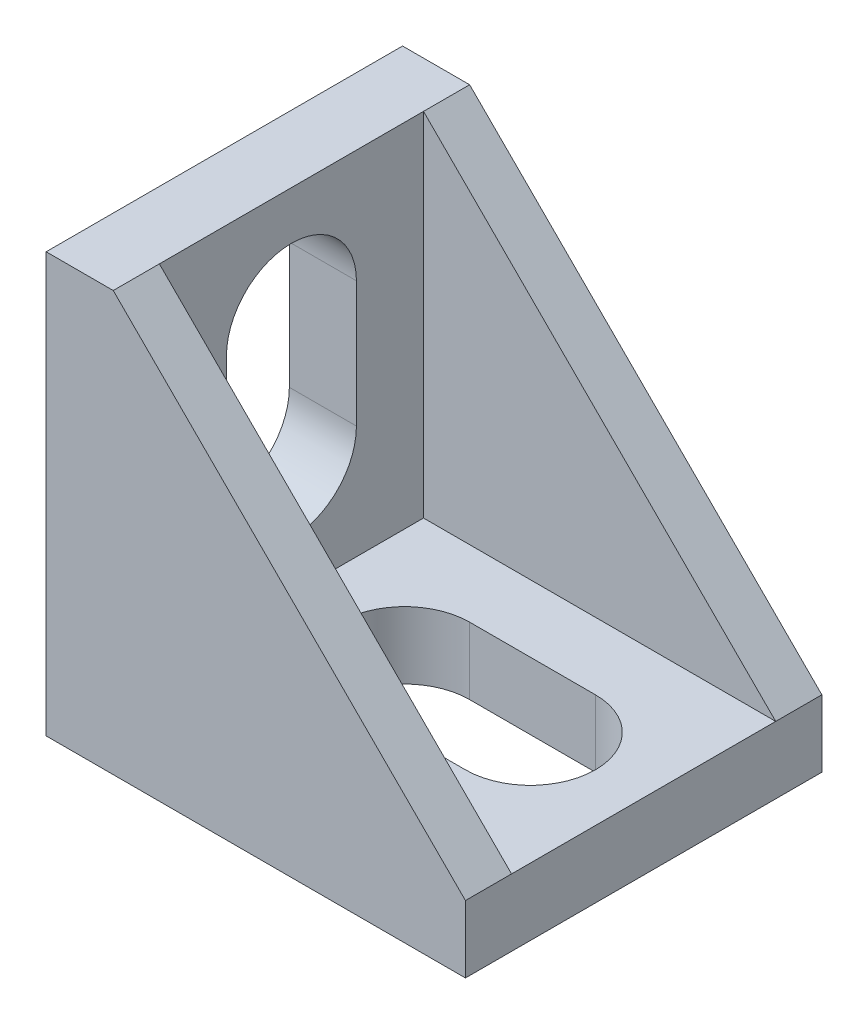
ISO-10303-21;
HEADER;
FILE_DESCRIPTION(('STEP AP214'),'2;1');
FILE_NAME('part.step','',(''),(''),'','','');
FILE_SCHEMA(('AUTOMOTIVE_DESIGN { 1 0 10303 214 1 1 1 1 }'));
ENDSEC;
DATA;
#1=APPLICATION_CONTEXT('core data for automotive mechanical design processes');
#2=APPLICATION_PROTOCOL_DEFINITION('international standard','automotive_design',2000,#1);
#3=PRODUCT_CONTEXT('',#1,'mechanical');
#4=PRODUCT('Part','Part','',(#3));
#5=PRODUCT_RELATED_PRODUCT_CATEGORY('part','',(#4));
#6=PRODUCT_DEFINITION_FORMATION('','',#4);
#7=PRODUCT_DEFINITION_CONTEXT('part definition',#1,'design');
#8=PRODUCT_DEFINITION('design','',#6,#7);
#9=PRODUCT_DEFINITION_SHAPE('','',#8);
#10=(LENGTH_UNIT() NAMED_UNIT(*) SI_UNIT(.MILLI.,.METRE.));
#11=(NAMED_UNIT(*) PLANE_ANGLE_UNIT() SI_UNIT($,.RADIAN.));
#12=(NAMED_UNIT(*) SI_UNIT($,.STERADIAN.) SOLID_ANGLE_UNIT());
#13=UNCERTAINTY_MEASURE_WITH_UNIT(LENGTH_MEASURE(1.E-05),#10,'distance_accuracy_value','');
#14=(GEOMETRIC_REPRESENTATION_CONTEXT(3) GLOBAL_UNCERTAINTY_ASSIGNED_CONTEXT((#13)) GLOBAL_UNIT_ASSIGNED_CONTEXT((#10,
#11,#12)) REPRESENTATION_CONTEXT('',''));
#15=CARTESIAN_POINT('',(0.,0.,0.));
#16=DIRECTION('',(0.,0.,1.));
#17=DIRECTION('',(1.,0.,0.));
#18=AXIS2_PLACEMENT_3D('',#15,#16,#17);
#19=CARTESIAN_POINT('',(3.2,20.,17.));
#20=DIRECTION('',(-0.707106781186547,-0.707106781186547,0.));
#21=DIRECTION('',(0.707106781186548,-0.707106781186548,0.));
#22=AXIS2_PLACEMENT_3D('',#19,#20,#21);
#23=PLANE('',#22);
#24=DIRECTION('',(0.,0.,-1.));
#25=VECTOR('',#24,1.);
#26=CARTESIAN_POINT('',(3.2,20.,17.));
#27=LINE('',#26,#25);
#28=CARTESIAN_POINT('',(3.2,20.,2.2));
#29=VERTEX_POINT('',#28);
#30=CARTESIAN_POINT('',(3.2,20.,0.));
#31=VERTEX_POINT('',#30);
#32=EDGE_CURVE('E259',#29,#31,#27,.T.);
#33=ORIENTED_EDGE('',*,*,#32,.F.);
#34=DIRECTION('',(0.707106781186548,-0.707106781186548,0.));
#35=VECTOR('',#34,1.);
#36=CARTESIAN_POINT('',(3.2,20.,2.2));
#37=LINE('',#36,#35);
#38=CARTESIAN_POINT('',(20.,3.2,2.2));
#39=VERTEX_POINT('',#38);
#40=EDGE_CURVE('E11',#29,#39,#37,.T.);
#41=ORIENTED_EDGE('',*,*,#40,.T.);
#42=DIRECTION('',(0.,0.,-1.));
#43=VECTOR('',#42,1.);
#44=CARTESIAN_POINT('',(20.,3.2,17.));
#45=LINE('',#44,#43);
#46=CARTESIAN_POINT('',(20.,3.2,0.));
#47=VERTEX_POINT('',#46);
#48=EDGE_CURVE('E263',#39,#47,#45,.T.);
#49=ORIENTED_EDGE('',*,*,#48,.T.);
#50=DIRECTION('',(-0.707106781186548,0.707106781186548,0.));
#51=VECTOR('',#50,1.);
#52=CARTESIAN_POINT('',(3.2,20.,0.));
#53=LINE('',#52,#51);
#54=EDGE_CURVE('E253',#47,#31,#53,.T.);
#55=ORIENTED_EDGE('',*,*,#54,.T.);
#56=EDGE_LOOP('',(#33,#41,#49,#55));
#57=FACE_BOUND('',#56,.T.);
#58=ADVANCED_FACE('F35',(#57),#23,.F.);
#59=CARTESIAN_POINT('',(0.,0.,17.));
#60=DIRECTION('',(1.,0.,0.));
#61=DIRECTION('',(0.,0.,-1.));
#62=AXIS2_PLACEMENT_3D('',#59,#60,#61);
#63=PLANE('',#62);
#64=DIRECTION('',(0.,1.,0.));
#65=VECTOR('',#64,1.);
#66=CARTESIAN_POINT('',(0.,0.,5.4));
#67=LINE('',#66,#65);
#68=CARTESIAN_POINT('',(0.,8.6,5.4));
#69=VERTEX_POINT('',#68);
#70=CARTESIAN_POINT('',(0.,14.6,5.4));
#71=VERTEX_POINT('',#70);
#72=EDGE_CURVE('E179',#69,#71,#67,.T.);
#73=ORIENTED_EDGE('',*,*,#72,.T.);
#74=CARTESIAN_POINT('',(0.,14.6,8.5));
#75=DIRECTION('',(1.,0.,0.));
#76=DIRECTION('',(0.,0.,-1.));
#77=AXIS2_PLACEMENT_3D('',#74,#75,#76);
#78=CIRCLE('',#77,3.1);
#79=CARTESIAN_POINT('',(0.,14.6,11.6));
#80=VERTEX_POINT('',#79);
#81=EDGE_CURVE('E182',#71,#80,#78,.T.);
#82=ORIENTED_EDGE('',*,*,#81,.T.);
#83=DIRECTION('',(0.,-1.,0.));
#84=VECTOR('',#83,1.);
#85=CARTESIAN_POINT('',(0.,0.,11.6));
#86=LINE('',#85,#84);
#87=CARTESIAN_POINT('',(0.,8.6,11.6));
#88=VERTEX_POINT('',#87);
#89=EDGE_CURVE('E174',#80,#88,#86,.T.);
#90=ORIENTED_EDGE('',*,*,#89,.T.);
#91=CARTESIAN_POINT('',(0.,8.6,8.5));
#92=DIRECTION('',(1.,0.,0.));
#93=DIRECTION('',(0.,0.,-1.));
#94=AXIS2_PLACEMENT_3D('',#91,#92,#93);
#95=CIRCLE('',#94,3.1);
#96=EDGE_CURVE('E154',#88,#69,#95,.T.);
#97=ORIENTED_EDGE('',*,*,#96,.T.);
#98=EDGE_LOOP('',(#73,#82,#90,#97));
#99=FACE_BOUND('',#98,.T.);
#100=DIRECTION('',(0.,-1.,0.));
#101=VECTOR('',#100,1.);
#102=CARTESIAN_POINT('',(0.,0.,0.));
#103=LINE('',#102,#101);
#104=CARTESIAN_POINT('',(0.,20.,0.));
#105=VERTEX_POINT('',#104);
#106=CARTESIAN_POINT('',(0.,0.,0.));
#107=VERTEX_POINT('',#106);
#108=EDGE_CURVE('E231',#105,#107,#103,.T.);
#109=ORIENTED_EDGE('',*,*,#108,.T.);
#110=DIRECTION('',(0.,0.,-1.));
#111=VECTOR('',#110,1.);
#112=CARTESIAN_POINT('',(0.,0.,17.));
#113=LINE('',#112,#111);
#114=CARTESIAN_POINT('',(0.,0.,17.));
#115=VERTEX_POINT('',#114);
#116=EDGE_CURVE('E271',#115,#107,#113,.T.);
#117=ORIENTED_EDGE('',*,*,#116,.F.);
#118=DIRECTION('',(0.,-1.,0.));
#119=VECTOR('',#118,1.);
#120=CARTESIAN_POINT('',(0.,0.,17.));
#121=LINE('',#120,#119);
#122=CARTESIAN_POINT('',(0.,20.,17.));
#123=VERTEX_POINT('',#122);
#124=EDGE_CURVE('E233',#123,#115,#121,.T.);
#125=ORIENTED_EDGE('',*,*,#124,.F.);
#126=DIRECTION('',(0.,0.,-1.));
#127=VECTOR('',#126,1.);
#128=CARTESIAN_POINT('',(0.,20.,17.));
#129=LINE('',#128,#127);
#130=EDGE_CURVE('E245',#123,#105,#129,.T.);
#131=ORIENTED_EDGE('',*,*,#130,.T.);
#132=EDGE_LOOP('',(#109,#117,#125,#131));
#133=FACE_BOUND('',#132,.T.);
#134=ADVANCED_FACE('F37',(#99,#133),#63,.F.);
#135=CARTESIAN_POINT('',(0.,0.,17.));
#136=DIRECTION('',(0.,1.,0.));
#137=DIRECTION('',(0.,0.,1.));
#138=AXIS2_PLACEMENT_3D('',#135,#136,#137);
#139=PLANE('',#138);
#140=DIRECTION('',(-1.,0.,0.));
#141=VECTOR('',#140,1.);
#142=CARTESIAN_POINT('',(0.,0.,5.4));
#143=LINE('',#142,#141);
#144=CARTESIAN_POINT('',(14.6,0.,5.4));
#145=VERTEX_POINT('',#144);
#146=CARTESIAN_POINT('',(8.6,0.,5.4));
#147=VERTEX_POINT('',#146);
#148=EDGE_CURVE('E211',#145,#147,#143,.T.);
#149=ORIENTED_EDGE('',*,*,#148,.T.);
#150=CARTESIAN_POINT('',(8.6,0.,8.5));
#151=DIRECTION('',(0.,1.,0.));
#152=DIRECTION('',(0.,0.,1.));
#153=AXIS2_PLACEMENT_3D('',#150,#151,#152);
#154=CIRCLE('',#153,3.1);
#155=CARTESIAN_POINT('',(8.6,0.,11.6));
#156=VERTEX_POINT('',#155);
#157=EDGE_CURVE('E214',#147,#156,#154,.T.);
#158=ORIENTED_EDGE('',*,*,#157,.T.);
#159=DIRECTION('',(1.,0.,0.));
#160=VECTOR('',#159,1.);
#161=CARTESIAN_POINT('',(0.,0.,11.6));
#162=LINE('',#161,#160);
#163=CARTESIAN_POINT('',(14.6,0.,11.6));
#164=VERTEX_POINT('',#163);
#165=EDGE_CURVE('E199',#156,#164,#162,.T.);
#166=ORIENTED_EDGE('',*,*,#165,.T.);
#167=CARTESIAN_POINT('',(14.6,0.,8.5));
#168=DIRECTION('',(0.,1.,0.));
#169=DIRECTION('',(0.,0.,1.));
#170=AXIS2_PLACEMENT_3D('',#167,#168,#169);
#171=CIRCLE('',#170,3.1);
#172=EDGE_CURVE('E208',#164,#145,#171,.T.);
#173=ORIENTED_EDGE('',*,*,#172,.T.);
#174=EDGE_LOOP('',(#149,#158,#166,#173));
#175=FACE_BOUND('',#174,.T.);
#176=DIRECTION('',(1.,0.,0.));
#177=VECTOR('',#176,1.);
#178=CARTESIAN_POINT('',(0.,0.,0.));
#179=LINE('',#178,#177);
#180=CARTESIAN_POINT('',(20.,0.,0.));
#181=VERTEX_POINT('',#180);
#182=EDGE_CURVE('E248',#107,#181,#179,.T.);
#183=ORIENTED_EDGE('',*,*,#182,.T.);
#184=DIRECTION('',(0.,0.,-1.));
#185=VECTOR('',#184,1.);
#186=CARTESIAN_POINT('',(20.,0.,17.));
#187=LINE('',#186,#185);
#188=CARTESIAN_POINT('',(20.,0.,17.));
#189=VERTEX_POINT('',#188);
#190=EDGE_CURVE('E267',#189,#181,#187,.T.);
#191=ORIENTED_EDGE('',*,*,#190,.F.);
#192=DIRECTION('',(1.,0.,0.));
#193=VECTOR('',#192,1.);
#194=CARTESIAN_POINT('',(0.,0.,17.));
#195=LINE('',#194,#193);
#196=EDGE_CURVE('E236',#115,#189,#195,.T.);
#197=ORIENTED_EDGE('',*,*,#196,.F.);
#198=ORIENTED_EDGE('',*,*,#116,.T.);
#199=EDGE_LOOP('',(#183,#191,#197,#198));
#200=FACE_BOUND('',#199,.T.);
#201=ADVANCED_FACE('F309',(#175,#200),#139,.F.);
#202=CARTESIAN_POINT('',(20.,0.,17.));
#203=DIRECTION('',(-1.,0.,0.));
#204=DIRECTION('',(0.,0.,1.));
#205=AXIS2_PLACEMENT_3D('',#202,#203,#204);
#206=PLANE('',#205);
#207=DIRECTION('',(0.,1.,0.));
#208=VECTOR('',#207,1.);
#209=CARTESIAN_POINT('',(20.,0.,0.));
#210=LINE('',#209,#208);
#211=EDGE_CURVE('E250',#181,#47,#210,.T.);
#212=ORIENTED_EDGE('',*,*,#211,.T.);
#213=ORIENTED_EDGE('',*,*,#48,.F.);
#214=CARTESIAN_POINT('',(20.,3.2,14.8));
#215=VERTEX_POINT('',#214);
#216=EDGE_CURVE('E268',#215,#39,#45,.T.);
#217=ORIENTED_EDGE('',*,*,#216,.F.);
#218=CARTESIAN_POINT('',(20.,3.2,17.));
#219=VERTEX_POINT('',#218);
#220=EDGE_CURVE('E264',#219,#215,#45,.T.);
#221=ORIENTED_EDGE('',*,*,#220,.F.);
#222=DIRECTION('',(0.,1.,0.));
#223=VECTOR('',#222,1.);
#224=CARTESIAN_POINT('',(20.,0.,17.));
#225=LINE('',#224,#223);
#226=EDGE_CURVE('E239',#189,#219,#225,.T.);
#227=ORIENTED_EDGE('',*,*,#226,.F.);
#228=ORIENTED_EDGE('',*,*,#190,.T.);
#229=EDGE_LOOP('',(#212,#213,#217,#221,#227,#228));
#230=FACE_BOUND('',#229,.T.);
#231=ADVANCED_FACE('F294',(#230),#206,.F.);
#232=ORIENTED_EDGE('',*,*,#220,.T.);
#233=DIRECTION('',(-0.707106781186548,0.707106781186548,0.));
#234=VECTOR('',#233,1.);
#235=CARTESIAN_POINT('',(3.2,20.,14.8));
#236=LINE('',#235,#234);
#237=CARTESIAN_POINT('',(3.2,20.,14.8));
#238=VERTEX_POINT('',#237);
#239=EDGE_CURVE('E43',#215,#238,#236,.T.);
#240=ORIENTED_EDGE('',*,*,#239,.T.);
#241=CARTESIAN_POINT('',(3.2,20.,17.));
#242=VERTEX_POINT('',#241);
#243=EDGE_CURVE('E260',#242,#238,#27,.T.);
#244=ORIENTED_EDGE('',*,*,#243,.F.);
#245=DIRECTION('',(-0.707106781186548,0.707106781186548,0.));
#246=VECTOR('',#245,1.);
#247=CARTESIAN_POINT('',(3.2,20.,17.));
#248=LINE('',#247,#246);
#249=EDGE_CURVE('E241',#219,#242,#248,.T.);
#250=ORIENTED_EDGE('',*,*,#249,.F.);
#251=EDGE_LOOP('',(#232,#240,#244,#250));
#252=FACE_BOUND('',#251,.T.);
#253=ADVANCED_FACE('F276',(#252),#23,.F.);
#254=CARTESIAN_POINT('',(0.,20.,17.));
#255=DIRECTION('',(0.,-1.,0.));
#256=DIRECTION('',(0.,0.,-1.));
#257=AXIS2_PLACEMENT_3D('',#254,#255,#256);
#258=PLANE('',#257);
#259=DIRECTION('',(-1.,0.,0.));
#260=VECTOR('',#259,1.);
#261=CARTESIAN_POINT('',(0.,20.,0.));
#262=LINE('',#261,#260);
#263=EDGE_CURVE('E237',#31,#105,#262,.T.);
#264=ORIENTED_EDGE('',*,*,#263,.T.);
#265=ORIENTED_EDGE('',*,*,#130,.F.);
#266=DIRECTION('',(-1.,0.,0.));
#267=VECTOR('',#266,1.);
#268=CARTESIAN_POINT('',(0.,20.,17.));
#269=LINE('',#268,#267);
#270=EDGE_CURVE('E243',#242,#123,#269,.T.);
#271=ORIENTED_EDGE('',*,*,#270,.F.);
#272=ORIENTED_EDGE('',*,*,#243,.T.);
#273=DIRECTION('',(0.,0.,1.));
#274=VECTOR('',#273,1.);
#275=CARTESIAN_POINT('',(3.2,20.,2.2));
#276=LINE('',#275,#274);
#277=EDGE_CURVE('E217',#29,#238,#276,.T.);
#278=ORIENTED_EDGE('',*,*,#277,.F.);
#279=ORIENTED_EDGE('',*,*,#32,.T.);
#280=EDGE_LOOP('',(#264,#265,#271,#272,#278,#279));
#281=FACE_BOUND('',#280,.T.);
#282=ADVANCED_FACE('F284',(#281),#258,.F.);
#283=CARTESIAN_POINT('',(0.,0.,17.));
#284=DIRECTION('',(0.,0.,-1.));
#285=DIRECTION('',(-1.,0.,0.));
#286=AXIS2_PLACEMENT_3D('',#283,#284,#285);
#287=PLANE('',#286);
#288=ORIENTED_EDGE('',*,*,#124,.T.);
#289=ORIENTED_EDGE('',*,*,#196,.T.);
#290=ORIENTED_EDGE('',*,*,#226,.T.);
#291=ORIENTED_EDGE('',*,*,#249,.T.);
#292=ORIENTED_EDGE('',*,*,#270,.T.);
#293=EDGE_LOOP('',(#288,#289,#290,#291,#292));
#294=FACE_BOUND('',#293,.T.);
#295=ADVANCED_FACE('F288',(#294),#287,.F.);
#296=CARTESIAN_POINT('',(0.,0.,0.));
#297=DIRECTION('',(0.,0.,-1.));
#298=DIRECTION('',(-1.,0.,0.));
#299=AXIS2_PLACEMENT_3D('',#296,#297,#298);
#300=PLANE('',#299);
#301=ORIENTED_EDGE('',*,*,#108,.F.);
#302=ORIENTED_EDGE('',*,*,#263,.F.);
#303=ORIENTED_EDGE('',*,*,#54,.F.);
#304=ORIENTED_EDGE('',*,*,#211,.F.);
#305=ORIENTED_EDGE('',*,*,#182,.F.);
#306=EDGE_LOOP('',(#301,#302,#303,#304,#305));
#307=FACE_BOUND('',#306,.T.);
#308=ADVANCED_FACE('F306',(#307),#300,.T.);
#309=CARTESIAN_POINT('',(3.2,3.2,2.2));
#310=DIRECTION('',(0.,0.,-1.));
#311=DIRECTION('',(-1.,0.,0.));
#312=AXIS2_PLACEMENT_3D('',#309,#310,#311);
#313=PLANE('',#312);
#314=DIRECTION('',(0.,1.,0.));
#315=VECTOR('',#314,1.);
#316=CARTESIAN_POINT('',(3.2,3.2,2.2));
#317=LINE('',#316,#315);
#318=CARTESIAN_POINT('',(3.2,3.2,2.2));
#319=VERTEX_POINT('',#318);
#320=EDGE_CURVE('E226',#319,#29,#317,.T.);
#321=ORIENTED_EDGE('',*,*,#320,.F.);
#322=DIRECTION('',(-1.,0.,0.));
#323=VECTOR('',#322,1.);
#324=CARTESIAN_POINT('',(3.2,3.2,2.2));
#325=LINE('',#324,#323);
#326=EDGE_CURVE('E218',#39,#319,#325,.T.);
#327=ORIENTED_EDGE('',*,*,#326,.F.);
#328=ORIENTED_EDGE('',*,*,#40,.F.);
#329=EDGE_LOOP('',(#321,#327,#328));
#330=FACE_BOUND('',#329,.T.);
#331=ADVANCED_FACE('F333',(#330),#313,.F.);
#332=CARTESIAN_POINT('',(23.0942394265217,3.2,14.8));
#333=DIRECTION('',(0.,0.,1.));
#334=DIRECTION('',(1.,0.,0.));
#335=AXIS2_PLACEMENT_3D('',#332,#333,#334);
#336=PLANE('',#335);
#337=DIRECTION('',(1.,0.,0.));
#338=VECTOR('',#337,1.);
#339=CARTESIAN_POINT('',(23.0942394265217,3.2,14.8));
#340=LINE('',#339,#338);
#341=CARTESIAN_POINT('',(3.2,3.2,14.8));
#342=VERTEX_POINT('',#341);
#343=EDGE_CURVE('E223',#342,#215,#340,.T.);
#344=ORIENTED_EDGE('',*,*,#343,.F.);
#345=DIRECTION('',(0.,1.,0.));
#346=VECTOR('',#345,1.);
#347=CARTESIAN_POINT('',(3.2,3.2,14.8));
#348=LINE('',#347,#346);
#349=EDGE_CURVE('E229',#342,#238,#348,.T.);
#350=ORIENTED_EDGE('',*,*,#349,.T.);
#351=ORIENTED_EDGE('',*,*,#239,.F.);
#352=EDGE_LOOP('',(#344,#350,#351));
#353=FACE_BOUND('',#352,.T.);
#354=ADVANCED_FACE('F337',(#353),#336,.F.);
#355=CARTESIAN_POINT('',(0.,3.2,0.));
#356=DIRECTION('',(0.,-1.,0.));
#357=DIRECTION('',(0.,0.,-1.));
#358=AXIS2_PLACEMENT_3D('',#355,#356,#357);
#359=PLANE('',#358);
#360=DIRECTION('',(1.,0.,0.));
#361=VECTOR('',#360,1.);
#362=CARTESIAN_POINT('',(14.6,3.2,11.6));
#363=LINE('',#362,#361);
#364=CARTESIAN_POINT('',(8.6,3.2,11.6));
#365=VERTEX_POINT('',#364);
#366=CARTESIAN_POINT('',(14.6,3.2,11.6));
#367=VERTEX_POINT('',#366);
#368=EDGE_CURVE('E187',#365,#367,#363,.T.);
#369=ORIENTED_EDGE('',*,*,#368,.F.);
#370=CARTESIAN_POINT('',(8.6,3.2,8.5));
#371=DIRECTION('',(0.,1.,0.));
#372=DIRECTION('',(0.,0.,1.));
#373=AXIS2_PLACEMENT_3D('',#370,#371,#372);
#374=CIRCLE('',#373,3.1);
#375=CARTESIAN_POINT('',(8.6,3.2,5.4));
#376=VERTEX_POINT('',#375);
#377=EDGE_CURVE('E185',#376,#365,#374,.T.);
#378=ORIENTED_EDGE('',*,*,#377,.F.);
#379=DIRECTION('',(-1.,0.,0.));
#380=VECTOR('',#379,1.);
#381=CARTESIAN_POINT('',(8.6,3.2,5.4));
#382=LINE('',#381,#380);
#383=CARTESIAN_POINT('',(14.6,3.2,5.4));
#384=VERTEX_POINT('',#383);
#385=EDGE_CURVE('E193',#384,#376,#382,.T.);
#386=ORIENTED_EDGE('',*,*,#385,.F.);
#387=CARTESIAN_POINT('',(14.6,3.2,8.5));
#388=DIRECTION('',(0.,1.,0.));
#389=DIRECTION('',(0.,0.,1.));
#390=AXIS2_PLACEMENT_3D('',#387,#388,#389);
#391=CIRCLE('',#390,3.1);
#392=EDGE_CURVE('E190',#367,#384,#391,.T.);
#393=ORIENTED_EDGE('',*,*,#392,.F.);
#394=EDGE_LOOP('',(#369,#378,#386,#393));
#395=FACE_BOUND('',#394,.T.);
#396=ORIENTED_EDGE('',*,*,#326,.T.);
#397=DIRECTION('',(0.,0.,1.));
#398=VECTOR('',#397,1.);
#399=CARTESIAN_POINT('',(3.2,3.2,2.2));
#400=LINE('',#399,#398);
#401=EDGE_CURVE('E220',#319,#342,#400,.T.);
#402=ORIENTED_EDGE('',*,*,#401,.T.);
#403=ORIENTED_EDGE('',*,*,#343,.T.);
#404=ORIENTED_EDGE('',*,*,#216,.T.);
#405=EDGE_LOOP('',(#396,#402,#403,#404));
#406=FACE_BOUND('',#405,.T.);
#407=ADVANCED_FACE('F342',(#395,#406),#359,.F.);
#408=CARTESIAN_POINT('',(3.2,3.2,2.2));
#409=DIRECTION('',(-1.,0.,0.));
#410=DIRECTION('',(0.,0.,1.));
#411=AXIS2_PLACEMENT_3D('',#408,#409,#410);
#412=PLANE('',#411);
#413=DIRECTION('',(0.,-1.,0.));
#414=VECTOR('',#413,1.);
#415=CARTESIAN_POINT('',(3.2,8.6,11.6));
#416=LINE('',#415,#414);
#417=CARTESIAN_POINT('',(3.2,14.6,11.6));
#418=VERTEX_POINT('',#417);
#419=CARTESIAN_POINT('',(3.2,8.6,11.6));
#420=VERTEX_POINT('',#419);
#421=EDGE_CURVE('E160',#418,#420,#416,.T.);
#422=ORIENTED_EDGE('',*,*,#421,.F.);
#423=CARTESIAN_POINT('',(3.2,14.6,8.5));
#424=DIRECTION('',(1.,0.,0.));
#425=DIRECTION('',(0.,0.,-1.));
#426=AXIS2_PLACEMENT_3D('',#423,#424,#425);
#427=CIRCLE('',#426,3.1);
#428=CARTESIAN_POINT('',(3.2,14.6,5.4));
#429=VERTEX_POINT('',#428);
#430=EDGE_CURVE('E58',#429,#418,#427,.T.);
#431=ORIENTED_EDGE('',*,*,#430,.F.);
#432=DIRECTION('',(0.,1.,0.));
#433=VECTOR('',#432,1.);
#434=CARTESIAN_POINT('',(3.2,14.6,5.4));
#435=LINE('',#434,#433);
#436=CARTESIAN_POINT('',(3.2,8.6,5.4));
#437=VERTEX_POINT('',#436);
#438=EDGE_CURVE('E167',#437,#429,#435,.T.);
#439=ORIENTED_EDGE('',*,*,#438,.F.);
#440=CARTESIAN_POINT('',(3.2,8.6,8.5));
#441=DIRECTION('',(1.,0.,0.));
#442=DIRECTION('',(0.,0.,-1.));
#443=AXIS2_PLACEMENT_3D('',#440,#441,#442);
#444=CIRCLE('',#443,3.1);
#445=EDGE_CURVE('E151',#420,#437,#444,.T.);
#446=ORIENTED_EDGE('',*,*,#445,.F.);
#447=EDGE_LOOP('',(#422,#431,#439,#446));
#448=FACE_BOUND('',#447,.T.);
#449=ORIENTED_EDGE('',*,*,#277,.T.);
#450=ORIENTED_EDGE('',*,*,#349,.F.);
#451=ORIENTED_EDGE('',*,*,#401,.F.);
#452=ORIENTED_EDGE('',*,*,#320,.T.);
#453=EDGE_LOOP('',(#449,#450,#451,#452));
#454=FACE_BOUND('',#453,.T.);
#455=ADVANCED_FACE('F164',(#448,#454),#412,.F.);
#456=CARTESIAN_POINT('',(8.6,-13.6,8.5));
#457=DIRECTION('',(0.,1.,0.));
#458=DIRECTION('',(0.,0.,1.));
#459=AXIS2_PLACEMENT_3D('',#456,#457,#458);
#460=CYLINDRICAL_SURFACE('',#459,3.1);
#461=DIRECTION('',(0.,1.,0.));
#462=VECTOR('',#461,1.);
#463=CARTESIAN_POINT('',(8.6,-13.6,5.4));
#464=LINE('',#463,#462);
#465=EDGE_CURVE('E197',#147,#376,#464,.T.);
#466=ORIENTED_EDGE('',*,*,#465,.T.);
#467=ORIENTED_EDGE('',*,*,#377,.T.);
#468=DIRECTION('',(0.,1.,0.));
#469=VECTOR('',#468,1.);
#470=CARTESIAN_POINT('',(8.6,-13.6,11.6));
#471=LINE('',#470,#469);
#472=EDGE_CURVE('E196',#156,#365,#471,.T.);
#473=ORIENTED_EDGE('',*,*,#472,.F.);
#474=ORIENTED_EDGE('',*,*,#157,.F.);
#475=EDGE_LOOP('',(#466,#467,#473,#474));
#476=FACE_BOUND('',#475,.T.);
#477=ADVANCED_FACE('F341',(#476),#460,.F.);
#478=CARTESIAN_POINT('',(8.6,-13.6,5.4));
#479=DIRECTION('',(0.,0.,-1.));
#480=DIRECTION('',(-1.,0.,0.));
#481=AXIS2_PLACEMENT_3D('',#478,#479,#480);
#482=PLANE('',#481);
#483=DIRECTION('',(0.,1.,0.));
#484=VECTOR('',#483,1.);
#485=CARTESIAN_POINT('',(14.6,-13.6,5.4));
#486=LINE('',#485,#484);
#487=EDGE_CURVE('E200',#145,#384,#486,.T.);
#488=ORIENTED_EDGE('',*,*,#487,.T.);
#489=ORIENTED_EDGE('',*,*,#385,.T.);
#490=ORIENTED_EDGE('',*,*,#465,.F.);
#491=ORIENTED_EDGE('',*,*,#148,.F.);
#492=EDGE_LOOP('',(#488,#489,#490,#491));
#493=FACE_BOUND('',#492,.T.);
#494=ADVANCED_FACE('F350',(#493),#482,.F.);
#495=CARTESIAN_POINT('',(14.6,-13.6,8.5));
#496=DIRECTION('',(0.,1.,0.));
#497=DIRECTION('',(0.,0.,1.));
#498=AXIS2_PLACEMENT_3D('',#495,#496,#497);
#499=CYLINDRICAL_SURFACE('',#498,3.1);
#500=DIRECTION('',(0.,1.,0.));
#501=VECTOR('',#500,1.);
#502=CARTESIAN_POINT('',(14.6,-13.6,11.6));
#503=LINE('',#502,#501);
#504=EDGE_CURVE('E202',#164,#367,#503,.T.);
#505=ORIENTED_EDGE('',*,*,#504,.T.);
#506=ORIENTED_EDGE('',*,*,#392,.T.);
#507=ORIENTED_EDGE('',*,*,#487,.F.);
#508=ORIENTED_EDGE('',*,*,#172,.F.);
#509=EDGE_LOOP('',(#505,#506,#507,#508));
#510=FACE_BOUND('',#509,.T.);
#511=ADVANCED_FACE('F356',(#510),#499,.F.);
#512=CARTESIAN_POINT('',(14.6,-13.6,11.6));
#513=DIRECTION('',(0.,0.,1.));
#514=DIRECTION('',(1.,0.,0.));
#515=AXIS2_PLACEMENT_3D('',#512,#513,#514);
#516=PLANE('',#515);
#517=ORIENTED_EDGE('',*,*,#472,.T.);
#518=ORIENTED_EDGE('',*,*,#368,.T.);
#519=ORIENTED_EDGE('',*,*,#504,.F.);
#520=ORIENTED_EDGE('',*,*,#165,.F.);
#521=EDGE_LOOP('',(#517,#518,#519,#520));
#522=FACE_BOUND('',#521,.T.);
#523=ADVANCED_FACE('F352',(#522),#516,.F.);
#524=CARTESIAN_POINT('',(-13.6,14.6,8.5));
#525=DIRECTION('',(1.,0.,0.));
#526=DIRECTION('',(0.,0.,-1.));
#527=AXIS2_PLACEMENT_3D('',#524,#525,#526);
#528=CYLINDRICAL_SURFACE('',#527,3.1);
#529=DIRECTION('',(1.,0.,0.));
#530=VECTOR('',#529,1.);
#531=CARTESIAN_POINT('',(-13.6,14.6,5.4));
#532=LINE('',#531,#530);
#533=EDGE_CURVE('E172',#71,#429,#532,.T.);
#534=ORIENTED_EDGE('',*,*,#533,.T.);
#535=ORIENTED_EDGE('',*,*,#430,.T.);
#536=DIRECTION('',(1.,0.,0.));
#537=VECTOR('',#536,1.);
#538=CARTESIAN_POINT('',(-13.6,14.6,11.6));
#539=LINE('',#538,#537);
#540=EDGE_CURVE('E157',#80,#418,#539,.T.);
#541=ORIENTED_EDGE('',*,*,#540,.F.);
#542=ORIENTED_EDGE('',*,*,#81,.F.);
#543=EDGE_LOOP('',(#534,#535,#541,#542));
#544=FACE_BOUND('',#543,.T.);
#545=ADVANCED_FACE('F355',(#544),#528,.F.);
#546=CARTESIAN_POINT('',(-13.6,14.6,5.4));
#547=DIRECTION('',(0.,0.,-1.));
#548=DIRECTION('',(-1.,0.,0.));
#549=AXIS2_PLACEMENT_3D('',#546,#547,#548);
#550=PLANE('',#549);
#551=DIRECTION('',(1.,0.,0.));
#552=VECTOR('',#551,1.);
#553=CARTESIAN_POINT('',(-13.6,8.6,5.4));
#554=LINE('',#553,#552);
#555=EDGE_CURVE('E156',#69,#437,#554,.T.);
#556=ORIENTED_EDGE('',*,*,#555,.T.);
#557=ORIENTED_EDGE('',*,*,#438,.T.);
#558=ORIENTED_EDGE('',*,*,#533,.F.);
#559=ORIENTED_EDGE('',*,*,#72,.F.);
#560=EDGE_LOOP('',(#556,#557,#558,#559));
#561=FACE_BOUND('',#560,.T.);
#562=ADVANCED_FACE('F366',(#561),#550,.F.);
#563=CARTESIAN_POINT('',(-13.6,8.6,8.5));
#564=DIRECTION('',(1.,0.,0.));
#565=DIRECTION('',(0.,0.,-1.));
#566=AXIS2_PLACEMENT_3D('',#563,#564,#565);
#567=CYLINDRICAL_SURFACE('',#566,3.1);
#568=DIRECTION('',(1.,0.,0.));
#569=VECTOR('',#568,1.);
#570=CARTESIAN_POINT('',(-13.6,8.6,11.6));
#571=LINE('',#570,#569);
#572=EDGE_CURVE('E50',#88,#420,#571,.T.);
#573=ORIENTED_EDGE('',*,*,#572,.T.);
#574=ORIENTED_EDGE('',*,*,#445,.T.);
#575=ORIENTED_EDGE('',*,*,#555,.F.);
#576=ORIENTED_EDGE('',*,*,#96,.F.);
#577=EDGE_LOOP('',(#573,#574,#575,#576));
#578=FACE_BOUND('',#577,.T.);
#579=ADVANCED_FACE('F148',(#578),#567,.F.);
#580=CARTESIAN_POINT('',(-13.6,8.6,11.6));
#581=DIRECTION('',(0.,0.,1.));
#582=DIRECTION('',(1.,0.,0.));
#583=AXIS2_PLACEMENT_3D('',#580,#581,#582);
#584=PLANE('',#583);
#585=ORIENTED_EDGE('',*,*,#540,.T.);
#586=ORIENTED_EDGE('',*,*,#421,.T.);
#587=ORIENTED_EDGE('',*,*,#572,.F.);
#588=ORIENTED_EDGE('',*,*,#89,.F.);
#589=EDGE_LOOP('',(#585,#586,#587,#588));
#590=FACE_BOUND('',#589,.T.);
#591=ADVANCED_FACE('F161',(#590),#584,.F.);
#592=CLOSED_SHELL('',(#58,#134,#201,#231,#253,#282,#295,#308,#331,#354,#407,#455,#477,#494,#511,
#523,#545,#562,#579,#591));
#593=MANIFOLD_SOLID_BREP('B2',#592);
#594=ADVANCED_BREP_SHAPE_REPRESENTATION('',(#18,#593),#14);
#595=SHAPE_DEFINITION_REPRESENTATION(#9,#594);
ENDSEC;
END-ISO-10303-21;
